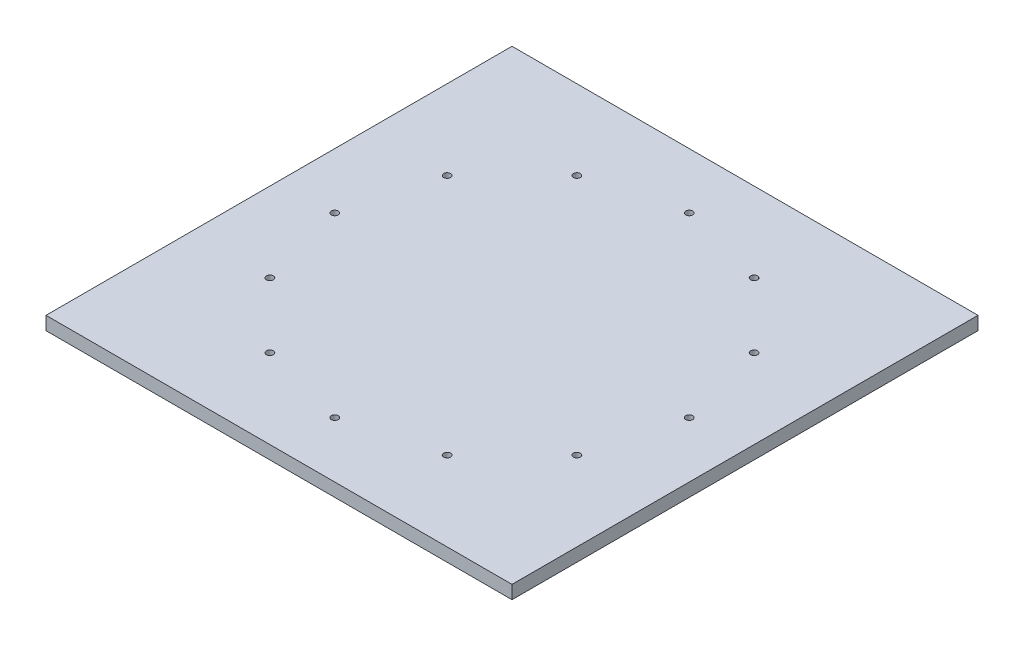
ISO-10303-21;
HEADER;
FILE_DESCRIPTION(('STEP AP214'),'2;1');
FILE_NAME('part.step','',(''),(''),'','','');
FILE_SCHEMA(('AUTOMOTIVE_DESIGN { 1 0 10303 214 1 1 1 1 }'));
ENDSEC;
DATA;
#1=APPLICATION_CONTEXT('core data for automotive mechanical design processes');
#2=APPLICATION_PROTOCOL_DEFINITION('international standard','automotive_design',2000,#1);
#3=PRODUCT_CONTEXT('',#1,'mechanical');
#4=PRODUCT('Part','Part','',(#3));
#5=PRODUCT_RELATED_PRODUCT_CATEGORY('part','',(#4));
#6=PRODUCT_DEFINITION_FORMATION('','',#4);
#7=PRODUCT_DEFINITION_CONTEXT('part definition',#1,'design');
#8=PRODUCT_DEFINITION('design','',#6,#7);
#9=PRODUCT_DEFINITION_SHAPE('','',#8);
#10=(LENGTH_UNIT() NAMED_UNIT(*) SI_UNIT(.MILLI.,.METRE.));
#11=(NAMED_UNIT(*) PLANE_ANGLE_UNIT() SI_UNIT($,.RADIAN.));
#12=(NAMED_UNIT(*) SI_UNIT($,.STERADIAN.) SOLID_ANGLE_UNIT());
#13=UNCERTAINTY_MEASURE_WITH_UNIT(LENGTH_MEASURE(1.E-05),#10,'distance_accuracy_value','');
#14=(GEOMETRIC_REPRESENTATION_CONTEXT(3) GLOBAL_UNCERTAINTY_ASSIGNED_CONTEXT((#13)) GLOBAL_UNIT_ASSIGNED_CONTEXT((#10,
#11,#12)) REPRESENTATION_CONTEXT('',''));
#15=CARTESIAN_POINT('',(0.,0.,0.));
#16=DIRECTION('',(0.,0.,1.));
#17=DIRECTION('',(1.,0.,0.));
#18=AXIS2_PLACEMENT_3D('',#15,#16,#17);
#19=CARTESIAN_POINT('',(33.8137499999993,5.08,58.5671329944326));
#20=DIRECTION('',(0.,-1.,0.));
#21=DIRECTION('',(-0.499999999999989,0.,-0.866025403784445));
#22=AXIS2_PLACEMENT_3D('',#19,#20,#21);
#23=CYLINDRICAL_SURFACE('',#22,1.3208);
#24=CARTESIAN_POINT('',(33.8137499999993,5.08,58.5671329944326));
#25=DIRECTION('',(0.,1.,0.));
#26=DIRECTION('',(0.499999999999989,0.,0.866025403784445));
#27=AXIS2_PLACEMENT_3D('',#24,#25,#26);
#28=CIRCLE('',#27,1.3208);
#29=CARTESIAN_POINT('',(34.4741499999992,5.08,59.7109793477511));
#30=VERTEX_POINT('',#29);
#31=EDGE_CURVE('E54',#30,#30,#28,.T.);
#32=ORIENTED_EDGE('',*,*,#31,.T.);
#33=EDGE_LOOP('',(#32));
#34=FACE_BOUND('',#33,.T.);
#35=CARTESIAN_POINT('',(33.8137499999993,0.,58.5671329944326));
#36=DIRECTION('',(0.,1.,0.));
#37=DIRECTION('',(0.499999999999989,0.,0.866025403784445));
#38=AXIS2_PLACEMENT_3D('',#35,#36,#37);
#39=CIRCLE('',#38,1.3208);
#40=CARTESIAN_POINT('',(34.4741499999992,0.,59.7109793477511));
#41=VERTEX_POINT('',#40);
#42=EDGE_CURVE('E11',#41,#41,#39,.T.);
#43=ORIENTED_EDGE('',*,*,#42,.F.);
#44=EDGE_LOOP('',(#43));
#45=FACE_BOUND('',#44,.T.);
#46=ADVANCED_FACE('F45',(#34,#45),#23,.F.);
#47=CARTESIAN_POINT('',(58.5671329944317,5.08,33.8137500000007));
#48=DIRECTION('',(0.,-1.,0.));
#49=DIRECTION('',(-0.866025403784433,0.,-0.50000000000001));
#50=AXIS2_PLACEMENT_3D('',#47,#48,#49);
#51=CYLINDRICAL_SURFACE('',#50,1.3208);
#52=CARTESIAN_POINT('',(58.5671329944317,5.08,33.8137500000007));
#53=DIRECTION('',(0.,1.,0.));
#54=DIRECTION('',(0.866025403784433,0.,0.50000000000001));
#55=AXIS2_PLACEMENT_3D('',#52,#53,#54);
#56=CIRCLE('',#55,1.3208);
#57=CARTESIAN_POINT('',(59.7109793477502,5.08,34.4741500000007));
#58=VERTEX_POINT('',#57);
#59=EDGE_CURVE('E214',#58,#58,#56,.T.);
#60=ORIENTED_EDGE('',*,*,#59,.T.);
#61=EDGE_LOOP('',(#60));
#62=FACE_BOUND('',#61,.T.);
#63=CARTESIAN_POINT('',(58.5671329944317,0.,33.8137500000007));
#64=DIRECTION('',(0.,1.,0.));
#65=DIRECTION('',(0.866025403784433,0.,0.50000000000001));
#66=AXIS2_PLACEMENT_3D('',#63,#64,#65);
#67=CIRCLE('',#66,1.3208);
#68=CARTESIAN_POINT('',(59.7109793477502,0.,34.4741500000007));
#69=VERTEX_POINT('',#68);
#70=EDGE_CURVE('E218',#69,#69,#67,.T.);
#71=ORIENTED_EDGE('',*,*,#70,.F.);
#72=EDGE_LOOP('',(#71));
#73=FACE_BOUND('',#72,.T.);
#74=ADVANCED_FACE('F278',(#62,#73),#51,.F.);
#75=CARTESIAN_POINT('',(67.6275,5.08,7.08360462727842E-13));
#76=DIRECTION('',(0.,-1.,0.));
#77=DIRECTION('',(-1.,0.,0.));
#78=AXIS2_PLACEMENT_3D('',#75,#76,#77);
#79=CYLINDRICAL_SURFACE('',#78,1.3208);
#80=CARTESIAN_POINT('',(67.6275,5.08,7.08360462727842E-13));
#81=DIRECTION('',(0.,1.,0.));
#82=DIRECTION('',(1.,0.,0.));
#83=AXIS2_PLACEMENT_3D('',#80,#81,#82);
#84=CIRCLE('',#83,1.3208);
#85=CARTESIAN_POINT('',(68.9483,5.08,7.22195108384874E-13));
#86=VERTEX_POINT('',#85);
#87=EDGE_CURVE('E206',#86,#86,#84,.T.);
#88=ORIENTED_EDGE('',*,*,#87,.T.);
#89=EDGE_LOOP('',(#88));
#90=FACE_BOUND('',#89,.T.);
#91=CARTESIAN_POINT('',(67.6275,0.,7.08360462727842E-13));
#92=DIRECTION('',(0.,1.,0.));
#93=DIRECTION('',(1.,0.,0.));
#94=AXIS2_PLACEMENT_3D('',#91,#92,#93);
#95=CIRCLE('',#94,1.3208);
#96=CARTESIAN_POINT('',(68.9483,0.,7.22195108384874E-13));
#97=VERTEX_POINT('',#96);
#98=EDGE_CURVE('E210',#97,#97,#95,.T.);
#99=ORIENTED_EDGE('',*,*,#98,.F.);
#100=EDGE_LOOP('',(#99));
#101=FACE_BOUND('',#100,.T.);
#102=ADVANCED_FACE('F282',(#90,#101),#79,.F.);
#103=CARTESIAN_POINT('',(58.5671329944324,5.08,-33.8137499999995));
#104=DIRECTION('',(0.,-1.,0.));
#105=DIRECTION('',(-0.866025403784443,0.,0.499999999999992));
#106=AXIS2_PLACEMENT_3D('',#103,#104,#105);
#107=CYLINDRICAL_SURFACE('',#106,1.3208);
#108=CARTESIAN_POINT('',(58.5671329944324,5.08,-33.8137499999995));
#109=DIRECTION('',(0.,1.,0.));
#110=DIRECTION('',(0.866025403784443,0.,-0.499999999999992));
#111=AXIS2_PLACEMENT_3D('',#108,#109,#110);
#112=CIRCLE('',#111,1.3208);
#113=CARTESIAN_POINT('',(59.7109793477509,5.08,-34.4741499999995));
#114=VERTEX_POINT('',#113);
#115=EDGE_CURVE('E198',#114,#114,#112,.T.);
#116=ORIENTED_EDGE('',*,*,#115,.T.);
#117=EDGE_LOOP('',(#116));
#118=FACE_BOUND('',#117,.T.);
#119=CARTESIAN_POINT('',(58.5671329944324,0.,-33.8137499999995));
#120=DIRECTION('',(0.,1.,0.));
#121=DIRECTION('',(0.866025403784443,0.,-0.499999999999992));
#122=AXIS2_PLACEMENT_3D('',#119,#120,#121);
#123=CIRCLE('',#122,1.3208);
#124=CARTESIAN_POINT('',(59.7109793477509,0.,-34.4741499999995));
#125=VERTEX_POINT('',#124);
#126=EDGE_CURVE('E202',#125,#125,#123,.T.);
#127=ORIENTED_EDGE('',*,*,#126,.F.);
#128=EDGE_LOOP('',(#127));
#129=FACE_BOUND('',#128,.T.);
#130=ADVANCED_FACE('F287',(#118,#129),#107,.F.);
#131=CARTESIAN_POINT('',(33.8137500000005,5.08,-58.5671329944319));
#132=DIRECTION('',(0.,-1.,0.));
#133=DIRECTION('',(-0.500000000000007,0.,0.866025403784435));
#134=AXIS2_PLACEMENT_3D('',#131,#132,#133);
#135=CYLINDRICAL_SURFACE('',#134,1.3208);
#136=CARTESIAN_POINT('',(33.8137500000005,5.08,-58.5671329944319));
#137=DIRECTION('',(0.,1.,0.));
#138=DIRECTION('',(0.500000000000007,0.,-0.866025403784435));
#139=AXIS2_PLACEMENT_3D('',#136,#137,#138);
#140=CIRCLE('',#139,1.3208);
#141=CARTESIAN_POINT('',(34.4741500000005,5.08,-59.7109793477503));
#142=VERTEX_POINT('',#141);
#143=EDGE_CURVE('E190',#142,#142,#140,.T.);
#144=ORIENTED_EDGE('',*,*,#143,.T.);
#145=EDGE_LOOP('',(#144));
#146=FACE_BOUND('',#145,.T.);
#147=CARTESIAN_POINT('',(33.8137500000005,0.,-58.5671329944319));
#148=DIRECTION('',(0.,1.,0.));
#149=DIRECTION('',(0.500000000000007,0.,-0.866025403784435));
#150=AXIS2_PLACEMENT_3D('',#147,#148,#149);
#151=CIRCLE('',#150,1.3208);
#152=CARTESIAN_POINT('',(34.4741500000005,0.,-59.7109793477503));
#153=VERTEX_POINT('',#152);
#154=EDGE_CURVE('E194',#153,#153,#151,.T.);
#155=ORIENTED_EDGE('',*,*,#154,.F.);
#156=EDGE_LOOP('',(#155));
#157=FACE_BOUND('',#156,.T.);
#158=ADVANCED_FACE('F294',(#146,#157),#135,.F.);
#159=CARTESIAN_POINT('',(0.,5.08,-67.6275));
#160=DIRECTION('',(0.,-1.,0.));
#161=DIRECTION('',(0.,0.,1.));
#162=AXIS2_PLACEMENT_3D('',#159,#160,#161);
#163=CYLINDRICAL_SURFACE('',#162,1.3208);
#164=CARTESIAN_POINT('',(0.,5.08,-67.6275));
#165=DIRECTION('',(0.,1.,0.));
#166=DIRECTION('',(0.,0.,-1.));
#167=AXIS2_PLACEMENT_3D('',#164,#165,#166);
#168=CIRCLE('',#167,1.3208);
#169=CARTESIAN_POINT('',(0.,5.08,-68.9483));
#170=VERTEX_POINT('',#169);
#171=EDGE_CURVE('E182',#170,#170,#168,.T.);
#172=ORIENTED_EDGE('',*,*,#171,.T.);
#173=EDGE_LOOP('',(#172));
#174=FACE_BOUND('',#173,.T.);
#175=CARTESIAN_POINT('',(0.,0.,-67.6275));
#176=DIRECTION('',(0.,1.,0.));
#177=DIRECTION('',(0.,0.,-1.));
#178=AXIS2_PLACEMENT_3D('',#175,#176,#177);
#179=CIRCLE('',#178,1.3208);
#180=CARTESIAN_POINT('',(0.,0.,-68.9483));
#181=VERTEX_POINT('',#180);
#182=EDGE_CURVE('E186',#181,#181,#179,.T.);
#183=ORIENTED_EDGE('',*,*,#182,.F.);
#184=EDGE_LOOP('',(#183));
#185=FACE_BOUND('',#184,.T.);
#186=ADVANCED_FACE('F298',(#174,#185),#163,.F.);
#187=CARTESIAN_POINT('',(-33.8137499999997,5.08,-58.5671329944323));
#188=DIRECTION('',(0.,-1.,0.));
#189=DIRECTION('',(0.499999999999995,0.,0.866025403784442));
#190=AXIS2_PLACEMENT_3D('',#187,#188,#189);
#191=CYLINDRICAL_SURFACE('',#190,1.3208);
#192=CARTESIAN_POINT('',(-33.8137499999997,5.08,-58.5671329944323));
#193=DIRECTION('',(0.,1.,0.));
#194=DIRECTION('',(-0.499999999999995,0.,-0.866025403784442));
#195=AXIS2_PLACEMENT_3D('',#192,#193,#194);
#196=CIRCLE('',#195,1.3208);
#197=CARTESIAN_POINT('',(-34.4741499999997,5.08,-59.7109793477508));
#198=VERTEX_POINT('',#197);
#199=EDGE_CURVE('E174',#198,#198,#196,.T.);
#200=ORIENTED_EDGE('',*,*,#199,.T.);
#201=EDGE_LOOP('',(#200));
#202=FACE_BOUND('',#201,.T.);
#203=CARTESIAN_POINT('',(-33.8137499999997,0.,-58.5671329944323));
#204=DIRECTION('',(0.,1.,0.));
#205=DIRECTION('',(-0.499999999999995,0.,-0.866025403784442));
#206=AXIS2_PLACEMENT_3D('',#203,#204,#205);
#207=CIRCLE('',#206,1.3208);
#208=CARTESIAN_POINT('',(-34.4741499999997,0.,-59.7109793477508));
#209=VERTEX_POINT('',#208);
#210=EDGE_CURVE('E178',#209,#209,#207,.T.);
#211=ORIENTED_EDGE('',*,*,#210,.F.);
#212=EDGE_LOOP('',(#211));
#213=FACE_BOUND('',#212,.T.);
#214=ADVANCED_FACE('F302',(#202,#213),#191,.F.);
#215=CARTESIAN_POINT('',(-58.567132994432,5.08,-33.8137500000003));
#216=DIRECTION('',(0.,-1.,0.));
#217=DIRECTION('',(0.866025403784436,0.,0.500000000000004));
#218=AXIS2_PLACEMENT_3D('',#215,#216,#217);
#219=CYLINDRICAL_SURFACE('',#218,1.3208);
#220=CARTESIAN_POINT('',(-58.567132994432,5.08,-33.8137500000003));
#221=DIRECTION('',(0.,1.,0.));
#222=DIRECTION('',(-0.866025403784436,0.,-0.500000000000004));
#223=AXIS2_PLACEMENT_3D('',#220,#221,#222);
#224=CIRCLE('',#223,1.3208);
#225=CARTESIAN_POINT('',(-59.7109793477505,5.08,-34.4741500000003));
#226=VERTEX_POINT('',#225);
#227=EDGE_CURVE('E166',#226,#226,#224,.T.);
#228=ORIENTED_EDGE('',*,*,#227,.T.);
#229=EDGE_LOOP('',(#228));
#230=FACE_BOUND('',#229,.T.);
#231=CARTESIAN_POINT('',(-58.567132994432,0.,-33.8137500000003));
#232=DIRECTION('',(0.,1.,0.));
#233=DIRECTION('',(-0.866025403784436,0.,-0.500000000000004));
#234=AXIS2_PLACEMENT_3D('',#231,#232,#233);
#235=CIRCLE('',#234,1.3208);
#236=CARTESIAN_POINT('',(-59.7109793477505,0.,-34.4741500000003));
#237=VERTEX_POINT('',#236);
#238=EDGE_CURVE('E170',#237,#237,#235,.T.);
#239=ORIENTED_EDGE('',*,*,#238,.F.);
#240=EDGE_LOOP('',(#239));
#241=FACE_BOUND('',#240,.T.);
#242=ADVANCED_FACE('F306',(#230,#241),#219,.F.);
#243=CARTESIAN_POINT('',(-67.6275,5.08,-2.36120154242614E-13));
#244=DIRECTION('',(0.,-1.,0.));
#245=DIRECTION('',(1.,0.,0.));
#246=AXIS2_PLACEMENT_3D('',#243,#244,#245);
#247=CYLINDRICAL_SURFACE('',#246,1.3208);
#248=CARTESIAN_POINT('',(-67.6275,5.08,-2.36120154242614E-13));
#249=DIRECTION('',(0.,1.,0.));
#250=DIRECTION('',(-1.,0.,0.));
#251=AXIS2_PLACEMENT_3D('',#248,#249,#250);
#252=CIRCLE('',#251,1.3208);
#253=CARTESIAN_POINT('',(-68.9483,5.08,-2.40731702794958E-13));
#254=VERTEX_POINT('',#253);
#255=EDGE_CURVE('E158',#254,#254,#252,.T.);
#256=ORIENTED_EDGE('',*,*,#255,.T.);
#257=EDGE_LOOP('',(#256));
#258=FACE_BOUND('',#257,.T.);
#259=CARTESIAN_POINT('',(-67.6275,0.,-2.36120154242614E-13));
#260=DIRECTION('',(0.,1.,0.));
#261=DIRECTION('',(-1.,0.,0.));
#262=AXIS2_PLACEMENT_3D('',#259,#260,#261);
#263=CIRCLE('',#262,1.3208);
#264=CARTESIAN_POINT('',(-68.9483,0.,-2.40731702794958E-13));
#265=VERTEX_POINT('',#264);
#266=EDGE_CURVE('E162',#265,#265,#263,.T.);
#267=ORIENTED_EDGE('',*,*,#266,.F.);
#268=EDGE_LOOP('',(#267));
#269=FACE_BOUND('',#268,.T.);
#270=ADVANCED_FACE('F310',(#258,#269),#247,.F.);
#271=CARTESIAN_POINT('',(-58.5671329944322,5.08,33.8137499999999));
#272=DIRECTION('',(0.,-1.,0.));
#273=DIRECTION('',(0.86602540378444,0.,-0.499999999999998));
#274=AXIS2_PLACEMENT_3D('',#271,#272,#273);
#275=CYLINDRICAL_SURFACE('',#274,1.3208);
#276=CARTESIAN_POINT('',(-58.5671329944322,5.08,33.8137499999999));
#277=DIRECTION('',(0.,1.,0.));
#278=DIRECTION('',(-0.86602540378444,0.,0.499999999999998));
#279=AXIS2_PLACEMENT_3D('',#276,#277,#278);
#280=CIRCLE('',#279,1.3208);
#281=CARTESIAN_POINT('',(-59.7109793477507,5.08,34.4741499999999));
#282=VERTEX_POINT('',#281);
#283=EDGE_CURVE('E150',#282,#282,#280,.T.);
#284=ORIENTED_EDGE('',*,*,#283,.T.);
#285=EDGE_LOOP('',(#284));
#286=FACE_BOUND('',#285,.T.);
#287=CARTESIAN_POINT('',(-58.5671329944322,0.,33.8137499999999));
#288=DIRECTION('',(0.,1.,0.));
#289=DIRECTION('',(-0.86602540378444,0.,0.499999999999998));
#290=AXIS2_PLACEMENT_3D('',#287,#288,#289);
#291=CIRCLE('',#290,1.3208);
#292=CARTESIAN_POINT('',(-59.7109793477507,0.,34.4741499999999));
#293=VERTEX_POINT('',#292);
#294=EDGE_CURVE('E154',#293,#293,#291,.T.);
#295=ORIENTED_EDGE('',*,*,#294,.F.);
#296=EDGE_LOOP('',(#295));
#297=FACE_BOUND('',#296,.T.);
#298=ADVANCED_FACE('F274',(#286,#297),#275,.F.);
#299=CARTESIAN_POINT('',(-33.8137500000001,5.08,58.5671329944321));
#300=DIRECTION('',(0.,-1.,0.));
#301=DIRECTION('',(0.500000000000001,0.,-0.866025403784438));
#302=AXIS2_PLACEMENT_3D('',#299,#300,#301);
#303=CYLINDRICAL_SURFACE('',#302,1.3208);
#304=CARTESIAN_POINT('',(-33.8137500000001,5.08,58.5671329944321));
#305=DIRECTION('',(0.,1.,0.));
#306=DIRECTION('',(-0.500000000000001,0.,0.866025403784438));
#307=AXIS2_PLACEMENT_3D('',#304,#305,#306);
#308=CIRCLE('',#307,1.3208);
#309=CARTESIAN_POINT('',(-34.4741500000001,5.08,59.7109793477506));
#310=VERTEX_POINT('',#309);
#311=EDGE_CURVE('E142',#310,#310,#308,.T.);
#312=ORIENTED_EDGE('',*,*,#311,.T.);
#313=EDGE_LOOP('',(#312));
#314=FACE_BOUND('',#313,.T.);
#315=CARTESIAN_POINT('',(-33.8137500000001,0.,58.5671329944321));
#316=DIRECTION('',(0.,1.,0.));
#317=DIRECTION('',(-0.500000000000001,0.,0.866025403784438));
#318=AXIS2_PLACEMENT_3D('',#315,#316,#317);
#319=CIRCLE('',#318,1.3208);
#320=CARTESIAN_POINT('',(-34.4741500000001,0.,59.7109793477506));
#321=VERTEX_POINT('',#320);
#322=EDGE_CURVE('E146',#321,#321,#319,.T.);
#323=ORIENTED_EDGE('',*,*,#322,.F.);
#324=EDGE_LOOP('',(#323));
#325=FACE_BOUND('',#324,.T.);
#326=ADVANCED_FACE('F267',(#314,#325),#303,.F.);
#327=CARTESIAN_POINT('',(88.9,5.08,0.));
#328=DIRECTION('',(1.,0.,0.));
#329=DIRECTION('',(0.,0.,-1.));
#330=AXIS2_PLACEMENT_3D('',#327,#328,#329);
#331=PLANE('',#330);
#332=DIRECTION('',(0.,0.,1.));
#333=VECTOR('',#332,1.);
#334=CARTESIAN_POINT('',(88.9,0.,0.));
#335=LINE('',#334,#333);
#336=CARTESIAN_POINT('',(88.9,0.,-88.9));
#337=VERTEX_POINT('',#336);
#338=CARTESIAN_POINT('',(88.9,0.,88.9));
#339=VERTEX_POINT('',#338);
#340=EDGE_CURVE('E126',#337,#339,#335,.T.);
#341=ORIENTED_EDGE('',*,*,#340,.F.);
#342=DIRECTION('',(0.,-1.,0.));
#343=VECTOR('',#342,1.);
#344=CARTESIAN_POINT('',(88.9,5.08,-88.9));
#345=LINE('',#344,#343);
#346=CARTESIAN_POINT('',(88.9,5.08,-88.9));
#347=VERTEX_POINT('',#346);
#348=EDGE_CURVE('E89',#347,#337,#345,.T.);
#349=ORIENTED_EDGE('',*,*,#348,.F.);
#350=DIRECTION('',(0.,0.,1.));
#351=VECTOR('',#350,1.);
#352=CARTESIAN_POINT('',(88.9,5.08,0.));
#353=LINE('',#352,#351);
#354=CARTESIAN_POINT('',(88.9,5.08,88.9));
#355=VERTEX_POINT('',#354);
#356=EDGE_CURVE('E112',#347,#355,#353,.T.);
#357=ORIENTED_EDGE('',*,*,#356,.T.);
#358=DIRECTION('',(0.,-1.,0.));
#359=VECTOR('',#358,1.);
#360=CARTESIAN_POINT('',(88.9,5.08,88.9));
#361=LINE('',#360,#359);
#362=EDGE_CURVE('E86',#355,#339,#361,.T.);
#363=ORIENTED_EDGE('',*,*,#362,.T.);
#364=EDGE_LOOP('',(#341,#349,#357,#363));
#365=FACE_BOUND('',#364,.T.);
#366=ADVANCED_FACE('F265',(#365),#331,.T.);
#367=CARTESIAN_POINT('',(0.,5.08,-88.9));
#368=DIRECTION('',(0.,0.,-1.));
#369=DIRECTION('',(-1.,0.,0.));
#370=AXIS2_PLACEMENT_3D('',#367,#368,#369);
#371=PLANE('',#370);
#372=DIRECTION('',(1.,0.,0.));
#373=VECTOR('',#372,1.);
#374=CARTESIAN_POINT('',(0.,0.,-88.9));
#375=LINE('',#374,#373);
#376=CARTESIAN_POINT('',(-88.9,0.,-88.9));
#377=VERTEX_POINT('',#376);
#378=EDGE_CURVE('E100',#377,#337,#375,.T.);
#379=ORIENTED_EDGE('',*,*,#378,.F.);
#380=DIRECTION('',(0.,-1.,0.));
#381=VECTOR('',#380,1.);
#382=CARTESIAN_POINT('',(-88.9,5.08,-88.9));
#383=LINE('',#382,#381);
#384=CARTESIAN_POINT('',(-88.9,5.08,-88.9));
#385=VERTEX_POINT('',#384);
#386=EDGE_CURVE('E94',#385,#377,#383,.T.);
#387=ORIENTED_EDGE('',*,*,#386,.F.);
#388=DIRECTION('',(1.,0.,0.));
#389=VECTOR('',#388,1.);
#390=CARTESIAN_POINT('',(0.,5.08,-88.9));
#391=LINE('',#390,#389);
#392=EDGE_CURVE('E98',#385,#347,#391,.T.);
#393=ORIENTED_EDGE('',*,*,#392,.T.);
#394=ORIENTED_EDGE('',*,*,#348,.T.);
#395=EDGE_LOOP('',(#379,#387,#393,#394));
#396=FACE_BOUND('',#395,.T.);
#397=ADVANCED_FACE('F96',(#396),#371,.T.);
#398=CARTESIAN_POINT('',(-88.9,5.08,0.));
#399=DIRECTION('',(1.,0.,0.));
#400=DIRECTION('',(0.,0.,-1.));
#401=AXIS2_PLACEMENT_3D('',#398,#399,#400);
#402=PLANE('',#401);
#403=DIRECTION('',(0.,0.,1.));
#404=VECTOR('',#403,1.);
#405=CARTESIAN_POINT('',(-88.9,0.,0.));
#406=LINE('',#405,#404);
#407=CARTESIAN_POINT('',(-88.9,0.,88.9));
#408=VERTEX_POINT('',#407);
#409=EDGE_CURVE('E131',#377,#408,#406,.T.);
#410=ORIENTED_EDGE('',*,*,#409,.T.);
#411=DIRECTION('',(0.,-1.,0.));
#412=VECTOR('',#411,1.);
#413=CARTESIAN_POINT('',(-88.9,5.08,88.9));
#414=LINE('',#413,#412);
#415=CARTESIAN_POINT('',(-88.9,5.08,88.9));
#416=VERTEX_POINT('',#415);
#417=EDGE_CURVE('E104',#416,#408,#414,.T.);
#418=ORIENTED_EDGE('',*,*,#417,.F.);
#419=DIRECTION('',(0.,0.,1.));
#420=VECTOR('',#419,1.);
#421=CARTESIAN_POINT('',(-88.9,5.08,0.));
#422=LINE('',#421,#420);
#423=EDGE_CURVE('E107',#385,#416,#422,.T.);
#424=ORIENTED_EDGE('',*,*,#423,.F.);
#425=ORIENTED_EDGE('',*,*,#386,.T.);
#426=EDGE_LOOP('',(#410,#418,#424,#425));
#427=FACE_BOUND('',#426,.T.);
#428=ADVANCED_FACE('F108',(#427),#402,.F.);
#429=CARTESIAN_POINT('',(0.,5.08,67.6275));
#430=DIRECTION('',(0.,-1.,0.));
#431=DIRECTION('',(0.,0.,-1.));
#432=AXIS2_PLACEMENT_3D('',#429,#430,#431);
#433=CYLINDRICAL_SURFACE('',#432,1.3208);
#434=CARTESIAN_POINT('',(0.,5.08,67.6275));
#435=DIRECTION('',(0.,1.,0.));
#436=DIRECTION('',(0.,0.,1.));
#437=AXIS2_PLACEMENT_3D('',#434,#435,#436);
#438=CIRCLE('',#437,1.3208);
#439=CARTESIAN_POINT('',(0.,5.08,68.9483));
#440=VERTEX_POINT('',#439);
#441=EDGE_CURVE('E116',#440,#440,#438,.T.);
#442=ORIENTED_EDGE('',*,*,#441,.T.);
#443=EDGE_LOOP('',(#442));
#444=FACE_BOUND('',#443,.T.);
#445=CARTESIAN_POINT('',(0.,0.,67.6275));
#446=DIRECTION('',(0.,1.,0.));
#447=DIRECTION('',(0.,0.,1.));
#448=AXIS2_PLACEMENT_3D('',#445,#446,#447);
#449=CIRCLE('',#448,1.3208);
#450=CARTESIAN_POINT('',(0.,0.,68.9483));
#451=VERTEX_POINT('',#450);
#452=EDGE_CURVE('E122',#451,#451,#449,.T.);
#453=ORIENTED_EDGE('',*,*,#452,.F.);
#454=EDGE_LOOP('',(#453));
#455=FACE_BOUND('',#454,.T.);
#456=ADVANCED_FACE('F256',(#444,#455),#433,.F.);
#457=CARTESIAN_POINT('',(0.,5.08,88.9));
#458=DIRECTION('',(0.,0.,-1.));
#459=DIRECTION('',(-1.,0.,0.));
#460=AXIS2_PLACEMENT_3D('',#457,#458,#459);
#461=PLANE('',#460);
#462=DIRECTION('',(1.,0.,0.));
#463=VECTOR('',#462,1.);
#464=CARTESIAN_POINT('',(0.,0.,88.9));
#465=LINE('',#464,#463);
#466=EDGE_CURVE('E79',#408,#339,#465,.T.);
#467=ORIENTED_EDGE('',*,*,#466,.T.);
#468=ORIENTED_EDGE('',*,*,#362,.F.);
#469=DIRECTION('',(1.,0.,0.));
#470=VECTOR('',#469,1.);
#471=CARTESIAN_POINT('',(0.,5.08,88.9));
#472=LINE('',#471,#470);
#473=EDGE_CURVE('E62',#416,#355,#472,.T.);
#474=ORIENTED_EDGE('',*,*,#473,.F.);
#475=ORIENTED_EDGE('',*,*,#417,.T.);
#476=EDGE_LOOP('',(#467,#468,#474,#475));
#477=FACE_BOUND('',#476,.T.);
#478=ADVANCED_FACE('F230',(#477),#461,.F.);
#479=CARTESIAN_POINT('',(0.,5.08,0.));
#480=DIRECTION('',(0.,1.,0.));
#481=DIRECTION('',(0.,0.,1.));
#482=AXIS2_PLACEMENT_3D('',#479,#480,#481);
#483=PLANE('',#482);
#484=ORIENTED_EDGE('',*,*,#31,.F.);
#485=EDGE_LOOP('',(#484));
#486=FACE_BOUND('',#485,.T.);
#487=ORIENTED_EDGE('',*,*,#59,.F.);
#488=EDGE_LOOP('',(#487));
#489=FACE_BOUND('',#488,.T.);
#490=ORIENTED_EDGE('',*,*,#87,.F.);
#491=EDGE_LOOP('',(#490));
#492=FACE_BOUND('',#491,.T.);
#493=ORIENTED_EDGE('',*,*,#115,.F.);
#494=EDGE_LOOP('',(#493));
#495=FACE_BOUND('',#494,.T.);
#496=ORIENTED_EDGE('',*,*,#143,.F.);
#497=EDGE_LOOP('',(#496));
#498=FACE_BOUND('',#497,.T.);
#499=ORIENTED_EDGE('',*,*,#171,.F.);
#500=EDGE_LOOP('',(#499));
#501=FACE_BOUND('',#500,.T.);
#502=ORIENTED_EDGE('',*,*,#199,.F.);
#503=EDGE_LOOP('',(#502));
#504=FACE_BOUND('',#503,.T.);
#505=ORIENTED_EDGE('',*,*,#227,.F.);
#506=EDGE_LOOP('',(#505));
#507=FACE_BOUND('',#506,.T.);
#508=ORIENTED_EDGE('',*,*,#255,.F.);
#509=EDGE_LOOP('',(#508));
#510=FACE_BOUND('',#509,.T.);
#511=ORIENTED_EDGE('',*,*,#283,.F.);
#512=EDGE_LOOP('',(#511));
#513=FACE_BOUND('',#512,.T.);
#514=ORIENTED_EDGE('',*,*,#311,.F.);
#515=EDGE_LOOP('',(#514));
#516=FACE_BOUND('',#515,.T.);
#517=ORIENTED_EDGE('',*,*,#441,.F.);
#518=EDGE_LOOP('',(#517));
#519=FACE_BOUND('',#518,.T.);
#520=ORIENTED_EDGE('',*,*,#356,.F.);
#521=ORIENTED_EDGE('',*,*,#392,.F.);
#522=ORIENTED_EDGE('',*,*,#423,.T.);
#523=ORIENTED_EDGE('',*,*,#473,.T.);
#524=EDGE_LOOP('',(#520,#521,#522,#523));
#525=FACE_BOUND('',#524,.T.);
#526=ADVANCED_FACE('F111',(#486,#489,#492,#495,#498,#501,#504,#507,#510,#513,#516,#519,#525),
#483,.T.);
#527=CARTESIAN_POINT('',(0.,0.,0.));
#528=DIRECTION('',(0.,1.,0.));
#529=DIRECTION('',(0.,0.,1.));
#530=AXIS2_PLACEMENT_3D('',#527,#528,#529);
#531=PLANE('',#530);
#532=ORIENTED_EDGE('',*,*,#42,.T.);
#533=EDGE_LOOP('',(#532));
#534=FACE_BOUND('',#533,.T.);
#535=ORIENTED_EDGE('',*,*,#70,.T.);
#536=EDGE_LOOP('',(#535));
#537=FACE_BOUND('',#536,.T.);
#538=ORIENTED_EDGE('',*,*,#98,.T.);
#539=EDGE_LOOP('',(#538));
#540=FACE_BOUND('',#539,.T.);
#541=ORIENTED_EDGE('',*,*,#126,.T.);
#542=EDGE_LOOP('',(#541));
#543=FACE_BOUND('',#542,.T.);
#544=ORIENTED_EDGE('',*,*,#154,.T.);
#545=EDGE_LOOP('',(#544));
#546=FACE_BOUND('',#545,.T.);
#547=ORIENTED_EDGE('',*,*,#182,.T.);
#548=EDGE_LOOP('',(#547));
#549=FACE_BOUND('',#548,.T.);
#550=ORIENTED_EDGE('',*,*,#210,.T.);
#551=EDGE_LOOP('',(#550));
#552=FACE_BOUND('',#551,.T.);
#553=ORIENTED_EDGE('',*,*,#238,.T.);
#554=EDGE_LOOP('',(#553));
#555=FACE_BOUND('',#554,.T.);
#556=ORIENTED_EDGE('',*,*,#266,.T.);
#557=EDGE_LOOP('',(#556));
#558=FACE_BOUND('',#557,.T.);
#559=ORIENTED_EDGE('',*,*,#294,.T.);
#560=EDGE_LOOP('',(#559));
#561=FACE_BOUND('',#560,.T.);
#562=ORIENTED_EDGE('',*,*,#322,.T.);
#563=EDGE_LOOP('',(#562));
#564=FACE_BOUND('',#563,.T.);
#565=ORIENTED_EDGE('',*,*,#452,.T.);
#566=EDGE_LOOP('',(#565));
#567=FACE_BOUND('',#566,.T.);
#568=ORIENTED_EDGE('',*,*,#340,.T.);
#569=ORIENTED_EDGE('',*,*,#466,.F.);
#570=ORIENTED_EDGE('',*,*,#409,.F.);
#571=ORIENTED_EDGE('',*,*,#378,.T.);
#572=EDGE_LOOP('',(#568,#569,#570,#571));
#573=FACE_BOUND('',#572,.T.);
#574=ADVANCED_FACE('F229',(#534,#537,#540,#543,#546,#549,#552,#555,#558,#561,#564,#567,#573),
#531,.F.);
#575=CLOSED_SHELL('',(#46,#74,#102,#130,#158,#186,#214,#242,#270,#298,#326,#366,#397,#428,#456,
#478,#526,#574));
#576=MANIFOLD_SOLID_BREP('B2',#575);
#577=ADVANCED_BREP_SHAPE_REPRESENTATION('',(#18,#576),#14);
#578=SHAPE_DEFINITION_REPRESENTATION(#9,#577);
ENDSEC;
END-ISO-10303-21;
